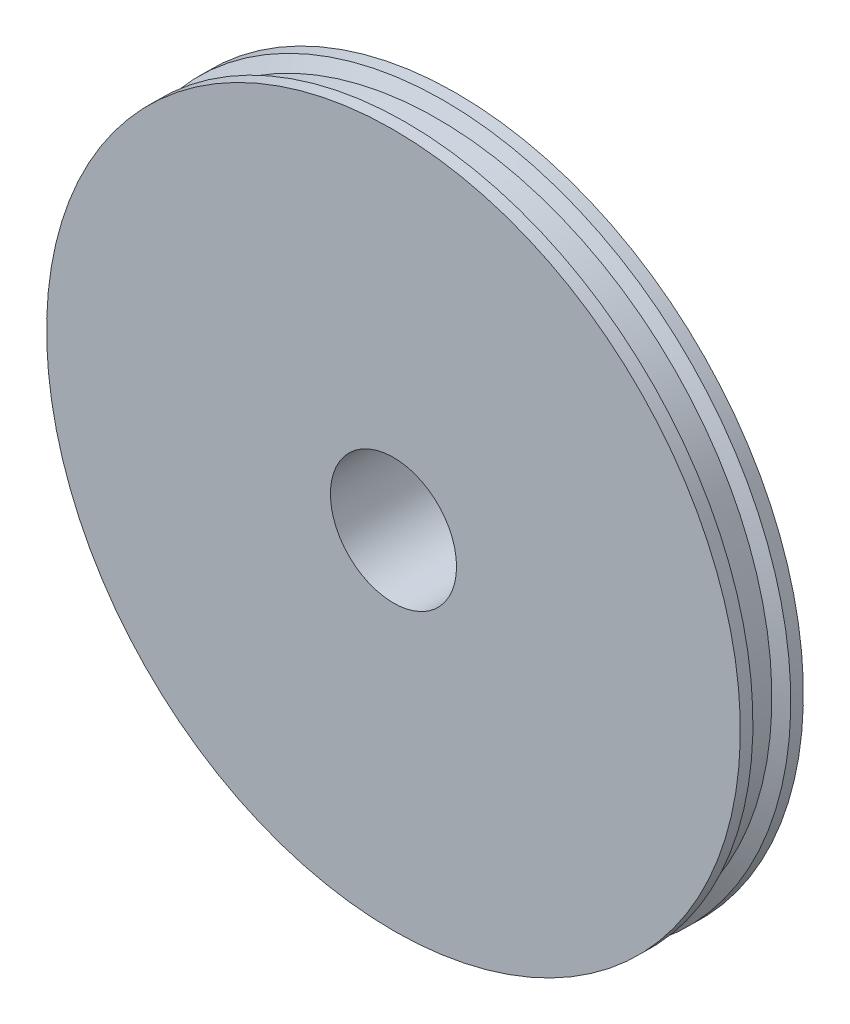
ISO-10303-21;
HEADER;
FILE_DESCRIPTION(('STEP AP214'),'2;1');
FILE_NAME('part.step','',(''),(''),'','','');
FILE_SCHEMA(('AUTOMOTIVE_DESIGN { 1 0 10303 214 1 1 1 1 }'));
ENDSEC;
DATA;
#1=APPLICATION_CONTEXT('core data for automotive mechanical design processes');
#2=APPLICATION_PROTOCOL_DEFINITION('international standard','automotive_design',2000,#1);
#3=PRODUCT_CONTEXT('',#1,'mechanical');
#4=PRODUCT('Part','Part','',(#3));
#5=PRODUCT_RELATED_PRODUCT_CATEGORY('part','',(#4));
#6=PRODUCT_DEFINITION_FORMATION('','',#4);
#7=PRODUCT_DEFINITION_CONTEXT('part definition',#1,'design');
#8=PRODUCT_DEFINITION('design','',#6,#7);
#9=PRODUCT_DEFINITION_SHAPE('','',#8);
#10=(LENGTH_UNIT() NAMED_UNIT(*) SI_UNIT(.MILLI.,.METRE.));
#11=(NAMED_UNIT(*) PLANE_ANGLE_UNIT() SI_UNIT($,.RADIAN.));
#12=(NAMED_UNIT(*) SI_UNIT($,.STERADIAN.) SOLID_ANGLE_UNIT());
#13=UNCERTAINTY_MEASURE_WITH_UNIT(LENGTH_MEASURE(1.E-05),#10,'distance_accuracy_value','');
#14=(GEOMETRIC_REPRESENTATION_CONTEXT(3) GLOBAL_UNCERTAINTY_ASSIGNED_CONTEXT((#13)) GLOBAL_UNIT_ASSIGNED_CONTEXT((#10,
#11,#12)) REPRESENTATION_CONTEXT('',''));
#15=CARTESIAN_POINT('',(0.,0.,0.));
#16=DIRECTION('',(0.,0.,1.));
#17=DIRECTION('',(1.,0.,0.));
#18=AXIS2_PLACEMENT_3D('',#15,#16,#17);
#19=CARTESIAN_POINT('',(80.4033279773208,45.6476090003614,-18.5));
#20=DIRECTION('',(0.,0.,1.));
#21=DIRECTION('',(-0.931795393260832,-0.362983946060831,0.));
#22=AXIS2_PLACEMENT_3D('',#19,#20,#21);
#23=CYLINDRICAL_SURFACE('',#22,27.5);
#24=CARTESIAN_POINT('',(80.4033279773208,45.6476090003614,-14.5));
#25=DIRECTION('',(0.,0.,1.));
#26=DIRECTION('',(-0.931795393260832,-0.362983946060831,0.));
#27=AXIS2_PLACEMENT_3D('',#24,#25,#26);
#28=CIRCLE('',#27,27.5);
#29=CARTESIAN_POINT('',(54.7789546626479,35.6655504836886,-14.5));
#30=VERTEX_POINT('',#29);
#31=EDGE_CURVE('E66',#30,#30,#28,.T.);
#32=ORIENTED_EDGE('',*,*,#31,.T.);
#33=EDGE_LOOP('',(#32));
#34=FACE_BOUND('',#33,.T.);
#35=CARTESIAN_POINT('',(80.4033279773208,45.6476090003614,-13.5));
#36=DIRECTION('',(0.,0.,-1.));
#37=DIRECTION('',(0.931795393260832,0.362983946060831,0.));
#38=AXIS2_PLACEMENT_3D('',#35,#36,#37);
#39=CIRCLE('',#38,27.5);
#40=CARTESIAN_POINT('',(106.027701291994,55.6296675170343,-13.5));
#41=VERTEX_POINT('',#40);
#42=EDGE_CURVE('E51',#41,#41,#39,.T.);
#43=ORIENTED_EDGE('',*,*,#42,.T.);
#44=EDGE_LOOP('',(#43));
#45=FACE_BOUND('',#44,.T.);
#46=ADVANCED_FACE('F36',(#34,#45),#23,.T.);
#47=CARTESIAN_POINT('',(80.4033279773208,45.6476090003614,-13.5));
#48=DIRECTION('',(0.,0.,-1.));
#49=DIRECTION('',(0.931795393260832,0.362983946060831,0.));
#50=AXIS2_PLACEMENT_3D('',#47,#48,#49);
#51=PLANE('',#50);
#52=ORIENTED_EDGE('',*,*,#42,.F.);
#53=EDGE_LOOP('',(#52));
#54=FACE_BOUND('',#53,.T.);
#55=CARTESIAN_POINT('',(80.4033279773208,45.6476090003614,-13.5));
#56=DIRECTION('',(0.,0.,-1.));
#57=DIRECTION('',(0.931795393260832,0.362983946060831,0.));
#58=AXIS2_PLACEMENT_3D('',#55,#56,#57);
#59=CIRCLE('',#58,5.);
#60=CARTESIAN_POINT('',(85.062304943625,47.4625287306656,-13.5));
#61=VERTEX_POINT('',#60);
#62=EDGE_CURVE('E55',#61,#61,#59,.T.);
#63=ORIENTED_EDGE('',*,*,#62,.T.);
#64=EDGE_LOOP('',(#63));
#65=FACE_BOUND('',#64,.T.);
#66=ADVANCED_FACE('F107',(#54,#65),#51,.F.);
#67=CARTESIAN_POINT('',(80.4033279773208,45.6476090003614,-18.5));
#68=DIRECTION('',(0.,0.,1.));
#69=DIRECTION('',(-0.931795393260832,-0.362983946060831,0.));
#70=AXIS2_PLACEMENT_3D('',#67,#68,#69);
#71=CYLINDRICAL_SURFACE('',#70,5.);
#72=ORIENTED_EDGE('',*,*,#62,.F.);
#73=EDGE_LOOP('',(#72));
#74=FACE_BOUND('',#73,.T.);
#75=CARTESIAN_POINT('',(80.4033279773208,45.6476090003614,-23.5));
#76=DIRECTION('',(0.,0.,-1.));
#77=DIRECTION('',(0.931795393260832,0.362983946060831,0.));
#78=AXIS2_PLACEMENT_3D('',#75,#76,#77);
#79=CIRCLE('',#78,5.);
#80=CARTESIAN_POINT('',(85.062304943625,47.4625287306656,-23.5));
#81=VERTEX_POINT('',#80);
#82=EDGE_CURVE('E62',#81,#81,#79,.T.);
#83=ORIENTED_EDGE('',*,*,#82,.T.);
#84=EDGE_LOOP('',(#83));
#85=FACE_BOUND('',#84,.T.);
#86=ADVANCED_FACE('F102',(#74,#85),#71,.F.);
#87=CARTESIAN_POINT('',(80.4033279773208,45.6476090003614,-23.5));
#88=DIRECTION('',(0.,0.,-1.));
#89=DIRECTION('',(0.931795393260832,0.362983946060831,0.));
#90=AXIS2_PLACEMENT_3D('',#87,#88,#89);
#91=PLANE('',#90);
#92=CARTESIAN_POINT('',(80.4033279773208,45.6476090003614,-23.5));
#93=DIRECTION('',(0.,0.,-1.));
#94=DIRECTION('',(0.931795393260832,0.362983946060831,0.));
#95=AXIS2_PLACEMENT_3D('',#92,#93,#94);
#96=CIRCLE('',#95,7.);
#97=CARTESIAN_POINT('',(86.9258957301466,48.1884966227873,-23.5));
#98=VERTEX_POINT('',#97);
#99=EDGE_CURVE('E59',#98,#98,#96,.T.);
#100=ORIENTED_EDGE('',*,*,#99,.T.);
#101=EDGE_LOOP('',(#100));
#102=FACE_BOUND('',#101,.T.);
#103=ORIENTED_EDGE('',*,*,#82,.F.);
#104=EDGE_LOOP('',(#103));
#105=FACE_BOUND('',#104,.T.);
#106=ADVANCED_FACE('F96',(#102,#105),#91,.T.);
#107=CARTESIAN_POINT('',(80.4033279773208,45.6476090003614,-23.5));
#108=DIRECTION('',(0.,0.,1.));
#109=DIRECTION('',(-0.931795393260832,-0.362983946060831,0.));
#110=AXIS2_PLACEMENT_3D('',#107,#108,#109);
#111=CYLINDRICAL_SURFACE('',#110,7.);
#112=CARTESIAN_POINT('',(80.4033279773208,45.6476090003614,-22.5));
#113=DIRECTION('',(0.,0.,1.));
#114=DIRECTION('',(-0.931795393260832,-0.362983946060831,0.));
#115=AXIS2_PLACEMENT_3D('',#112,#113,#114);
#116=CIRCLE('',#115,7.);
#117=CARTESIAN_POINT('',(73.880760224495,43.1067213779356,-22.5));
#118=VERTEX_POINT('',#117);
#119=EDGE_CURVE('E69',#118,#118,#116,.T.);
#120=ORIENTED_EDGE('',*,*,#119,.F.);
#121=EDGE_LOOP('',(#120));
#122=FACE_BOUND('',#121,.T.);
#123=ORIENTED_EDGE('',*,*,#99,.F.);
#124=EDGE_LOOP('',(#123));
#125=FACE_BOUND('',#124,.T.);
#126=ADVANCED_FACE('F92',(#122,#125),#111,.T.);
#127=CARTESIAN_POINT('',(80.4033279773208,45.6476090003614,-20.));
#128=DIRECTION('',(0.,0.,1.));
#129=DIRECTION('',(-0.931795393260832,-0.362983946060831,0.));
#130=AXIS2_PLACEMENT_3D('',#127,#128,#129);
#131=CONICAL_SURFACE('',#130,6.,1.10714871779409);
#132=CARTESIAN_POINT('',(80.4033279773208,45.6476090003614,-19.5));
#133=DIRECTION('',(0.,0.,1.));
#134=DIRECTION('',(-0.931795393260832,-0.362983946060831,0.));
#135=AXIS2_PLACEMENT_3D('',#132,#133,#134);
#136=CIRCLE('',#135,7.);
#137=CARTESIAN_POINT('',(73.880760224495,43.1067213779356,-19.5));
#138=VERTEX_POINT('',#137);
#139=EDGE_CURVE('E65',#138,#138,#136,.T.);
#140=ORIENTED_EDGE('',*,*,#139,.F.);
#141=EDGE_LOOP('',(#140));
#142=FACE_BOUND('',#141,.T.);
#143=CARTESIAN_POINT('',(80.4033279773208,45.6476090003614,-20.));
#144=DIRECTION('',(0.,0.,1.));
#145=DIRECTION('',(-0.931795393260832,-0.362983946060831,0.));
#146=AXIS2_PLACEMENT_3D('',#143,#144,#145);
#147=CIRCLE('',#146,6.);
#148=CARTESIAN_POINT('',(74.8125556177558,43.4697053239965,-20.));
#149=VERTEX_POINT('',#148);
#150=EDGE_CURVE('E81',#149,#149,#147,.T.);
#151=ORIENTED_EDGE('',*,*,#150,.T.);
#152=EDGE_LOOP('',(#151));
#153=FACE_BOUND('',#152,.T.);
#154=ADVANCED_FACE('F95',(#142,#153),#131,.T.);
#155=CARTESIAN_POINT('',(80.4033279773208,45.6476090003614,-13.5));
#156=DIRECTION('',(0.,0.,1.));
#157=DIRECTION('',(-0.931795393260832,-0.362983946060831,0.));
#158=AXIS2_PLACEMENT_3D('',#155,#156,#157);
#159=CYLINDRICAL_SURFACE('',#158,6.);
#160=ORIENTED_EDGE('',*,*,#150,.F.);
#161=EDGE_LOOP('',(#160));
#162=FACE_BOUND('',#161,.T.);
#163=CARTESIAN_POINT('',(80.4033279773208,45.6476090003614,-22.));
#164=DIRECTION('',(0.,0.,1.));
#165=DIRECTION('',(-0.931795393260832,-0.362983946060831,0.));
#166=AXIS2_PLACEMENT_3D('',#163,#164,#165);
#167=CIRCLE('',#166,6.);
#168=CARTESIAN_POINT('',(74.8125556177558,43.4697053239965,-22.));
#169=VERTEX_POINT('',#168);
#170=EDGE_CURVE('E84',#169,#169,#167,.T.);
#171=ORIENTED_EDGE('',*,*,#170,.T.);
#172=EDGE_LOOP('',(#171));
#173=FACE_BOUND('',#172,.T.);
#174=ADVANCED_FACE('F131',(#162,#173),#159,.T.);
#175=CARTESIAN_POINT('',(80.4033279773208,45.6476090003614,-22.5));
#176=DIRECTION('',(0.,0.,-1.));
#177=DIRECTION('',(0.931795393260832,0.362983946060831,0.));
#178=AXIS2_PLACEMENT_3D('',#175,#176,#177);
#179=CONICAL_SURFACE('',#178,7.,1.10714871779409);
#180=ORIENTED_EDGE('',*,*,#170,.F.);
#181=EDGE_LOOP('',(#180));
#182=FACE_BOUND('',#181,.T.);
#183=ORIENTED_EDGE('',*,*,#119,.T.);
#184=EDGE_LOOP('',(#183));
#185=FACE_BOUND('',#184,.T.);
#186=ADVANCED_FACE('F90',(#182,#185),#179,.T.);
#187=CARTESIAN_POINT('',(80.4033279773208,45.6476090003614,-17.5));
#188=DIRECTION('',(0.,0.,1.));
#189=DIRECTION('',(-0.931795393260832,-0.362983946060831,0.));
#190=AXIS2_PLACEMENT_3D('',#187,#188,#189);
#191=CIRCLE('',#190,27.5);
#192=CARTESIAN_POINT('',(54.7789546626479,35.6655504836886,-17.5));
#193=VERTEX_POINT('',#192);
#194=EDGE_CURVE('E76',#193,#193,#191,.T.);
#195=ORIENTED_EDGE('',*,*,#194,.F.);
#196=EDGE_LOOP('',(#195));
#197=FACE_BOUND('',#196,.T.);
#198=CARTESIAN_POINT('',(80.4033279773208,45.6476090003614,-18.5));
#199=DIRECTION('',(0.,0.,-1.));
#200=DIRECTION('',(0.931795393260832,0.362983946060831,0.));
#201=AXIS2_PLACEMENT_3D('',#198,#199,#200);
#202=CIRCLE('',#201,27.5);
#203=CARTESIAN_POINT('',(106.027701291994,55.6296675170343,-18.5));
#204=VERTEX_POINT('',#203);
#205=EDGE_CURVE('E47',#204,#204,#202,.T.);
#206=ORIENTED_EDGE('',*,*,#205,.F.);
#207=EDGE_LOOP('',(#206));
#208=FACE_BOUND('',#207,.T.);
#209=ADVANCED_FACE('F119',(#197,#208),#23,.T.);
#210=CARTESIAN_POINT('',(80.4033279773208,45.6476090003614,-18.5));
#211=DIRECTION('',(0.,0.,-1.));
#212=DIRECTION('',(0.931795393260832,0.362983946060831,0.));
#213=AXIS2_PLACEMENT_3D('',#210,#211,#212);
#214=PLANE('',#213);
#215=CARTESIAN_POINT('',(80.4033279773208,45.6476090003614,-18.5));
#216=DIRECTION('',(0.,0.,-1.));
#217=DIRECTION('',(0.931795393260832,0.362983946060831,0.));
#218=AXIS2_PLACEMENT_3D('',#215,#216,#217);
#219=CIRCLE('',#218,19.);
#220=CARTESIAN_POINT('',(98.1074404492766,52.5443039755172,-18.5));
#221=VERTEX_POINT('',#220);
#222=EDGE_CURVE('E43',#221,#221,#219,.F.);
#223=ORIENTED_EDGE('',*,*,#222,.T.);
#224=EDGE_LOOP('',(#223));
#225=FACE_BOUND('',#224,.T.);
#226=ORIENTED_EDGE('',*,*,#205,.T.);
#227=EDGE_LOOP('',(#226));
#228=FACE_BOUND('',#227,.T.);
#229=ADVANCED_FACE('F124',(#225,#228),#214,.T.);
#230=CARTESIAN_POINT('',(80.4033279773208,45.6476090003614,-15.));
#231=DIRECTION('',(0.,0.,1.));
#232=DIRECTION('',(-0.931795393260832,-0.362983946060831,0.));
#233=AXIS2_PLACEMENT_3D('',#230,#231,#232);
#234=CONICAL_SURFACE('',#233,26.5,1.10714871779409);
#235=ORIENTED_EDGE('',*,*,#31,.F.);
#236=EDGE_LOOP('',(#235));
#237=FACE_BOUND('',#236,.T.);
#238=CARTESIAN_POINT('',(80.4033279773208,45.6476090003614,-15.));
#239=DIRECTION('',(0.,0.,1.));
#240=DIRECTION('',(-0.931795393260832,-0.362983946060831,0.));
#241=AXIS2_PLACEMENT_3D('',#238,#239,#240);
#242=CIRCLE('',#241,26.5);
#243=CARTESIAN_POINT('',(55.7107500559088,36.0285344297494,-15.));
#244=VERTEX_POINT('',#243);
#245=EDGE_CURVE('E70',#244,#244,#242,.T.);
#246=ORIENTED_EDGE('',*,*,#245,.T.);
#247=EDGE_LOOP('',(#246));
#248=FACE_BOUND('',#247,.T.);
#249=ADVANCED_FACE('F129',(#237,#248),#234,.T.);
#250=CARTESIAN_POINT('',(80.4033279773208,45.6476090003614,-13.5));
#251=DIRECTION('',(0.,0.,1.));
#252=DIRECTION('',(-0.931795393260832,-0.362983946060831,0.));
#253=AXIS2_PLACEMENT_3D('',#250,#251,#252);
#254=CYLINDRICAL_SURFACE('',#253,26.5);
#255=ORIENTED_EDGE('',*,*,#245,.F.);
#256=EDGE_LOOP('',(#255));
#257=FACE_BOUND('',#256,.T.);
#258=CARTESIAN_POINT('',(80.4033279773208,45.6476090003614,-17.));
#259=DIRECTION('',(0.,0.,1.));
#260=DIRECTION('',(-0.931795393260832,-0.362983946060831,0.));
#261=AXIS2_PLACEMENT_3D('',#258,#259,#260);
#262=CIRCLE('',#261,26.5);
#263=CARTESIAN_POINT('',(55.7107500559088,36.0285344297494,-17.));
#264=VERTEX_POINT('',#263);
#265=EDGE_CURVE('E73',#264,#264,#262,.T.);
#266=ORIENTED_EDGE('',*,*,#265,.T.);
#267=EDGE_LOOP('',(#266));
#268=FACE_BOUND('',#267,.T.);
#269=ADVANCED_FACE('F142',(#257,#268),#254,.T.);
#270=CARTESIAN_POINT('',(80.4033279773208,45.6476090003614,-17.5));
#271=DIRECTION('',(0.,0.,-1.));
#272=DIRECTION('',(0.931795393260832,0.362983946060831,0.));
#273=AXIS2_PLACEMENT_3D('',#270,#271,#272);
#274=CONICAL_SURFACE('',#273,27.5,1.10714871779409);
#275=ORIENTED_EDGE('',*,*,#265,.F.);
#276=EDGE_LOOP('',(#275));
#277=FACE_BOUND('',#276,.T.);
#278=ORIENTED_EDGE('',*,*,#194,.T.);
#279=EDGE_LOOP('',(#278));
#280=FACE_BOUND('',#279,.T.);
#281=ADVANCED_FACE('F139',(#277,#280),#274,.T.);
#282=CARTESIAN_POINT('',(73.880760224495,43.1067213779356,-19.5));
#283=DIRECTION('',(0.,0.,-1.));
#284=DIRECTION('',(0.931795393260832,0.362983946060831,0.));
#285=AXIS2_PLACEMENT_3D('',#282,#283,#284);
#286=PLANE('',#285);
#287=CARTESIAN_POINT('',(80.4033279773208,45.6476090003614,-19.5));
#288=DIRECTION('',(0.,0.,-1.));
#289=DIRECTION('',(0.931795393260832,0.362983946060831,0.));
#290=AXIS2_PLACEMENT_3D('',#287,#288,#289);
#291=CIRCLE('',#290,18.);
#292=CARTESIAN_POINT('',(97.1756450560158,52.1813200294564,-19.5));
#293=VERTEX_POINT('',#292);
#294=EDGE_CURVE('E10',#293,#293,#291,.T.);
#295=ORIENTED_EDGE('',*,*,#294,.T.);
#296=EDGE_LOOP('',(#295));
#297=FACE_BOUND('',#296,.T.);
#298=ORIENTED_EDGE('',*,*,#139,.T.);
#299=EDGE_LOOP('',(#298));
#300=FACE_BOUND('',#299,.T.);
#301=ADVANCED_FACE('F141',(#297,#300),#286,.T.);
#302=CARTESIAN_POINT('',(80.4033279773208,45.6476090003614,-20.5));
#303=DIRECTION('',(0.,0.,1.));
#304=DIRECTION('',(-0.931795393260832,-0.362983946060831,0.));
#305=AXIS2_PLACEMENT_3D('',#302,#303,#304);
#306=CONICAL_SURFACE('',#305,17.,0.785398163397443);
#307=ORIENTED_EDGE('',*,*,#222,.F.);
#308=EDGE_LOOP('',(#307));
#309=FACE_BOUND('',#308,.T.);
#310=ORIENTED_EDGE('',*,*,#294,.F.);
#311=EDGE_LOOP('',(#310));
#312=FACE_BOUND('',#311,.T.);
#313=ADVANCED_FACE('F38',(#309,#312),#306,.T.);
#314=CLOSED_SHELL('',(#46,#66,#86,#106,#126,#154,#174,#186,#209,#229,#249,#269,#281,#301,#313));
#315=MANIFOLD_SOLID_BREP('B2',#314);
#316=ADVANCED_BREP_SHAPE_REPRESENTATION('',(#18,#315),#14);
#317=SHAPE_DEFINITION_REPRESENTATION(#9,#316);
ENDSEC;
END-ISO-10303-21;
